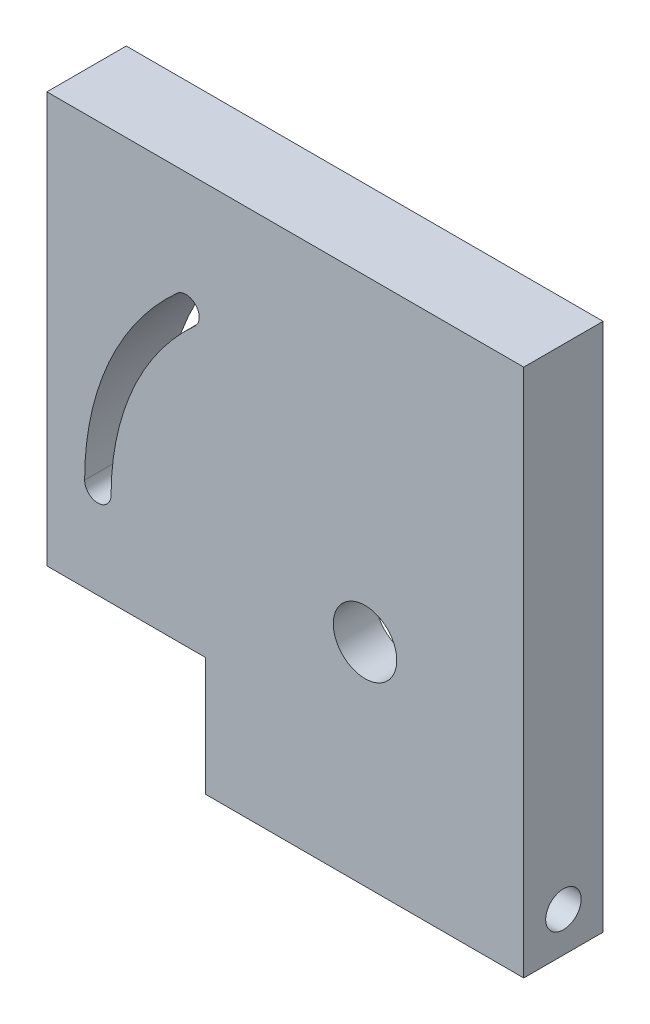
ISO-10303-21;
HEADER;
FILE_DESCRIPTION(('STEP AP214'),'2;1');
FILE_NAME('part.step','',(''),(''),'','','');
FILE_SCHEMA(('AUTOMOTIVE_DESIGN { 1 0 10303 214 1 1 1 1 }'));
ENDSEC;
DATA;
#1=APPLICATION_CONTEXT('core data for automotive mechanical design processes');
#2=APPLICATION_PROTOCOL_DEFINITION('international standard','automotive_design',2000,#1);
#3=PRODUCT_CONTEXT('',#1,'mechanical');
#4=PRODUCT('Part','Part','',(#3));
#5=PRODUCT_RELATED_PRODUCT_CATEGORY('part','',(#4));
#6=PRODUCT_DEFINITION_FORMATION('','',#4);
#7=PRODUCT_DEFINITION_CONTEXT('part definition',#1,'design');
#8=PRODUCT_DEFINITION('design','',#6,#7);
#9=PRODUCT_DEFINITION_SHAPE('','',#8);
#10=(LENGTH_UNIT() NAMED_UNIT(*) SI_UNIT(.MILLI.,.METRE.));
#11=(NAMED_UNIT(*) PLANE_ANGLE_UNIT() SI_UNIT($,.RADIAN.));
#12=(NAMED_UNIT(*) SI_UNIT($,.STERADIAN.) SOLID_ANGLE_UNIT());
#13=UNCERTAINTY_MEASURE_WITH_UNIT(LENGTH_MEASURE(1.E-05),#10,'distance_accuracy_value','');
#14=(GEOMETRIC_REPRESENTATION_CONTEXT(3) GLOBAL_UNCERTAINTY_ASSIGNED_CONTEXT((#13)) GLOBAL_UNIT_ASSIGNED_CONTEXT((#10,
#11,#12)) REPRESENTATION_CONTEXT('',''));
#15=CARTESIAN_POINT('',(0.,0.,0.));
#16=DIRECTION('',(0.,0.,1.));
#17=DIRECTION('',(1.,0.,0.));
#18=AXIS2_PLACEMENT_3D('',#15,#16,#17);
#19=CARTESIAN_POINT('',(-60.1333786137793,60.,0.));
#20=DIRECTION('',(-1.,0.,0.));
#21=DIRECTION('',(0.,-1.,0.));
#22=AXIS2_PLACEMENT_3D('',#19,#20,#21);
#23=PLANE('',#22);
#24=DIRECTION('',(0.,0.,-1.));
#25=VECTOR('',#24,1.);
#26=CARTESIAN_POINT('',(-60.1333786137793,-17.6108597435363,0.));
#27=LINE('',#26,#25);
#28=CARTESIAN_POINT('',(-60.1333786137793,-17.6108597435363,15.));
#29=VERTEX_POINT('',#28);
#30=CARTESIAN_POINT('',(-60.1333786137793,-17.6108597435363,0.));
#31=VERTEX_POINT('',#30);
#32=EDGE_CURVE('E164',#29,#31,#27,.T.);
#33=ORIENTED_EDGE('',*,*,#32,.F.);
#34=DIRECTION('',(0.,-1.,0.));
#35=VECTOR('',#34,1.);
#36=CARTESIAN_POINT('',(-60.1333786137793,60.,15.));
#37=LINE('',#36,#35);
#38=CARTESIAN_POINT('',(-60.1333786137793,60.,15.));
#39=VERTEX_POINT('',#38);
#40=EDGE_CURVE('E194',#39,#29,#37,.T.);
#41=ORIENTED_EDGE('',*,*,#40,.F.);
#42=DIRECTION('',(0.,0.,1.));
#43=VECTOR('',#42,1.);
#44=CARTESIAN_POINT('',(-60.1333786137793,60.,0.));
#45=LINE('',#44,#43);
#46=CARTESIAN_POINT('',(-60.1333786137793,60.,0.));
#47=VERTEX_POINT('',#46);
#48=EDGE_CURVE('E11',#47,#39,#45,.T.);
#49=ORIENTED_EDGE('',*,*,#48,.F.);
#50=DIRECTION('',(0.,-1.,0.));
#51=VECTOR('',#50,1.);
#52=CARTESIAN_POINT('',(-60.1333786137793,60.,0.));
#53=LINE('',#52,#51);
#54=EDGE_CURVE('E195',#47,#31,#53,.T.);
#55=ORIENTED_EDGE('',*,*,#54,.T.);
#56=EDGE_LOOP('',(#33,#41,#49,#55));
#57=FACE_BOUND('',#56,.T.);
#58=ADVANCED_FACE('F41',(#57),#23,.T.);
#59=CARTESIAN_POINT('',(30.,60.,0.));
#60=DIRECTION('',(0.,1.,0.));
#61=DIRECTION('',(0.,0.,1.));
#62=AXIS2_PLACEMENT_3D('',#59,#60,#61);
#63=PLANE('',#62);
#64=DIRECTION('',(-1.,0.,0.));
#65=VECTOR('',#64,1.);
#66=CARTESIAN_POINT('',(30.,60.,15.));
#67=LINE('',#66,#65);
#68=CARTESIAN_POINT('',(30.,60.,15.));
#69=VERTEX_POINT('',#68);
#70=EDGE_CURVE('E199',#69,#39,#67,.T.);
#71=ORIENTED_EDGE('',*,*,#70,.F.);
#72=DIRECTION('',(0.,0.,1.));
#73=VECTOR('',#72,1.);
#74=CARTESIAN_POINT('',(30.,60.,0.));
#75=LINE('',#74,#73);
#76=CARTESIAN_POINT('',(30.,60.,0.));
#77=VERTEX_POINT('',#76);
#78=EDGE_CURVE('E49',#77,#69,#75,.T.);
#79=ORIENTED_EDGE('',*,*,#78,.F.);
#80=DIRECTION('',(-1.,0.,0.));
#81=VECTOR('',#80,1.);
#82=CARTESIAN_POINT('',(30.,60.,0.));
#83=LINE('',#82,#81);
#84=EDGE_CURVE('E204',#77,#47,#83,.T.);
#85=ORIENTED_EDGE('',*,*,#84,.T.);
#86=ORIENTED_EDGE('',*,*,#48,.T.);
#87=EDGE_LOOP('',(#71,#79,#85,#86));
#88=FACE_BOUND('',#87,.T.);
#89=ADVANCED_FACE('F233',(#88),#63,.T.);
#90=CARTESIAN_POINT('',(30.,-40.,0.));
#91=DIRECTION('',(1.,0.,0.));
#92=DIRECTION('',(0.,0.,-1.));
#93=AXIS2_PLACEMENT_3D('',#90,#91,#92);
#94=PLANE('',#93);
#95=CARTESIAN_POINT('',(30.,-32.5,7.5));
#96=DIRECTION('',(1.,0.,0.));
#97=DIRECTION('',(0.,0.,-1.));
#98=AXIS2_PLACEMENT_3D('',#95,#96,#97);
#99=CIRCLE('',#98,3.35);
#100=CARTESIAN_POINT('',(30.,-32.5,4.15));
#101=VERTEX_POINT('',#100);
#102=EDGE_CURVE('E151',#101,#101,#99,.T.);
#103=ORIENTED_EDGE('',*,*,#102,.F.);
#104=EDGE_LOOP('',(#103));
#105=FACE_BOUND('',#104,.T.);
#106=DIRECTION('',(0.,1.,0.));
#107=VECTOR('',#106,1.);
#108=CARTESIAN_POINT('',(30.,-40.,15.));
#109=LINE('',#108,#107);
#110=CARTESIAN_POINT('',(30.,-40.,15.));
#111=VERTEX_POINT('',#110);
#112=EDGE_CURVE('E211',#111,#69,#109,.T.);
#113=ORIENTED_EDGE('',*,*,#112,.F.);
#114=DIRECTION('',(0.,0.,1.));
#115=VECTOR('',#114,1.);
#116=CARTESIAN_POINT('',(30.,-40.,0.));
#117=LINE('',#116,#115);
#118=CARTESIAN_POINT('',(30.,-40.,0.));
#119=VERTEX_POINT('',#118);
#120=EDGE_CURVE('E44',#119,#111,#117,.T.);
#121=ORIENTED_EDGE('',*,*,#120,.F.);
#122=DIRECTION('',(0.,1.,0.));
#123=VECTOR('',#122,1.);
#124=CARTESIAN_POINT('',(30.,-40.,0.));
#125=LINE('',#124,#123);
#126=EDGE_CURVE('E201',#119,#77,#125,.T.);
#127=ORIENTED_EDGE('',*,*,#126,.T.);
#128=ORIENTED_EDGE('',*,*,#78,.T.);
#129=EDGE_LOOP('',(#113,#121,#127,#128));
#130=FACE_BOUND('',#129,.T.);
#131=ADVANCED_FACE('F225',(#105,#130),#94,.T.);
#132=CARTESIAN_POINT('',(-60.1333786137793,-40.,0.));
#133=DIRECTION('',(0.,-1.,0.));
#134=DIRECTION('',(0.,0.,-1.));
#135=AXIS2_PLACEMENT_3D('',#132,#133,#134);
#136=PLANE('',#135);
#137=DIRECTION('',(0.,0.,1.));
#138=VECTOR('',#137,1.);
#139=CARTESIAN_POINT('',(-30.1333786137793,-40.,0.));
#140=LINE('',#139,#138);
#141=CARTESIAN_POINT('',(-30.1333786137793,-40.,0.));
#142=VERTEX_POINT('',#141);
#143=CARTESIAN_POINT('',(-30.1333786137793,-40.,15.));
#144=VERTEX_POINT('',#143);
#145=EDGE_CURVE('E169',#142,#144,#140,.T.);
#146=ORIENTED_EDGE('',*,*,#145,.F.);
#147=DIRECTION('',(1.,0.,0.));
#148=VECTOR('',#147,1.);
#149=CARTESIAN_POINT('',(-60.1333786137793,-40.,0.));
#150=LINE('',#149,#148);
#151=EDGE_CURVE('E198',#142,#119,#150,.T.);
#152=ORIENTED_EDGE('',*,*,#151,.T.);
#153=ORIENTED_EDGE('',*,*,#120,.T.);
#154=DIRECTION('',(1.,0.,0.));
#155=VECTOR('',#154,1.);
#156=CARTESIAN_POINT('',(-60.1333786137793,-40.,15.));
#157=LINE('',#156,#155);
#158=EDGE_CURVE('E209',#144,#111,#157,.T.);
#159=ORIENTED_EDGE('',*,*,#158,.F.);
#160=EDGE_LOOP('',(#146,#152,#153,#159));
#161=FACE_BOUND('',#160,.T.);
#162=ADVANCED_FACE('F222',(#161),#136,.T.);
#163=CARTESIAN_POINT('',(0.,0.,0.));
#164=DIRECTION('',(0.,0.,1.));
#165=DIRECTION('',(1.,0.,0.));
#166=AXIS2_PLACEMENT_3D('',#163,#164,#165);
#167=PLANE('',#166);
#168=CARTESIAN_POINT('',(4.30211422042248E-13,-1.90819582357449E-13,0.));
#169=DIRECTION('',(0.,0.,-1.));
#170=DIRECTION('',(1.,0.,0.));
#171=AXIS2_PLACEMENT_3D('',#168,#169,#170);
#172=CIRCLE('',#171,48.0033208953854);
#173=CARTESIAN_POINT('',(-48.0033208953849,0.,0.));
#174=VERTEX_POINT('',#173);
#175=CARTESIAN_POINT('',(-32.1736462526308,35.6254867166173,0.));
#176=VERTEX_POINT('',#175);
#177=EDGE_CURVE('E126',#174,#176,#172,.T.);
#178=ORIENTED_EDGE('',*,*,#177,.T.);
#179=CARTESIAN_POINT('',(-33.8492410683909,37.480852452368,0.));
#180=DIRECTION('',(0.,0.,1.));
#181=DIRECTION('',(1.,0.,0.));
#182=AXIS2_PLACEMENT_3D('',#179,#180,#181);
#183=CIRCLE('',#182,2.50000000000001);
#184=CARTESIAN_POINT('',(-35.524835884151,39.3362181881187,0.));
#185=VERTEX_POINT('',#184);
#186=EDGE_CURVE('E120',#176,#185,#183,.T.);
#187=ORIENTED_EDGE('',*,*,#186,.T.);
#188=CARTESIAN_POINT('',(4.30211422042248E-13,-1.90819582357449E-13,0.));
#189=DIRECTION('',(0.,0.,1.));
#190=DIRECTION('',(1.,0.,0.));
#191=AXIS2_PLACEMENT_3D('',#188,#189,#190);
#192=CIRCLE('',#191,53.0033208953854);
#193=CARTESIAN_POINT('',(-53.0033208953849,0.,0.));
#194=VERTEX_POINT('',#193);
#195=EDGE_CURVE('E129',#185,#194,#192,.T.);
#196=ORIENTED_EDGE('',*,*,#195,.T.);
#197=CARTESIAN_POINT('',(-50.5033208953849,0.,0.));
#198=DIRECTION('',(0.,0.,1.));
#199=DIRECTION('',(1.,0.,0.));
#200=AXIS2_PLACEMENT_3D('',#197,#198,#199);
#201=CIRCLE('',#200,2.5);
#202=EDGE_CURVE('E57',#194,#174,#201,.T.);
#203=ORIENTED_EDGE('',*,*,#202,.T.);
#204=EDGE_LOOP('',(#178,#187,#196,#203));
#205=FACE_BOUND('',#204,.T.);
#206=CARTESIAN_POINT('',(0.,0.,0.));
#207=DIRECTION('',(0.,0.,-1.));
#208=DIRECTION('',(-1.,0.,0.));
#209=AXIS2_PLACEMENT_3D('',#206,#207,#208);
#210=CIRCLE('',#209,17.5);
#211=CARTESIAN_POINT('',(-17.5,0.,0.));
#212=VERTEX_POINT('',#211);
#213=EDGE_CURVE('E181',#212,#212,#210,.T.);
#214=ORIENTED_EDGE('',*,*,#213,.F.);
#215=EDGE_LOOP('',(#214));
#216=FACE_BOUND('',#215,.T.);
#217=DIRECTION('',(0.,-1.,0.));
#218=VECTOR('',#217,1.);
#219=CARTESIAN_POINT('',(-30.1333786137793,-40.,0.));
#220=LINE('',#219,#218);
#221=CARTESIAN_POINT('',(-30.1333786137793,-17.6108597435363,0.));
#222=VERTEX_POINT('',#221);
#223=EDGE_CURVE('E167',#222,#142,#220,.T.);
#224=ORIENTED_EDGE('',*,*,#223,.F.);
#225=DIRECTION('',(-1.,0.,0.));
#226=VECTOR('',#225,1.);
#227=CARTESIAN_POINT('',(-30.1333786137793,-17.6108597435363,0.));
#228=LINE('',#227,#226);
#229=EDGE_CURVE('E178',#222,#31,#228,.T.);
#230=ORIENTED_EDGE('',*,*,#229,.T.);
#231=ORIENTED_EDGE('',*,*,#54,.F.);
#232=ORIENTED_EDGE('',*,*,#84,.F.);
#233=ORIENTED_EDGE('',*,*,#126,.F.);
#234=ORIENTED_EDGE('',*,*,#151,.F.);
#235=EDGE_LOOP('',(#224,#230,#231,#232,#233,#234));
#236=FACE_BOUND('',#235,.T.);
#237=ADVANCED_FACE('F133',(#205,#216,#236),#167,.F.);
#238=CARTESIAN_POINT('',(0.,0.,15.));
#239=DIRECTION('',(0.,0.,1.));
#240=DIRECTION('',(1.,0.,0.));
#241=AXIS2_PLACEMENT_3D('',#238,#239,#240);
#242=PLANE('',#241);
#243=CARTESIAN_POINT('',(-33.8492410683909,37.480852452368,15.));
#244=DIRECTION('',(0.,0.,1.));
#245=DIRECTION('',(1.,0.,0.));
#246=AXIS2_PLACEMENT_3D('',#243,#244,#245);
#247=CIRCLE('',#246,2.50000000000001);
#248=CARTESIAN_POINT('',(-32.1736462526308,35.6254867166173,15.));
#249=VERTEX_POINT('',#248);
#250=CARTESIAN_POINT('',(-35.524835884151,39.3362181881187,15.));
#251=VERTEX_POINT('',#250);
#252=EDGE_CURVE('E65',#249,#251,#247,.T.);
#253=ORIENTED_EDGE('',*,*,#252,.F.);
#254=CARTESIAN_POINT('',(4.30211422042248E-13,-1.90819582357449E-13,15.));
#255=DIRECTION('',(0.,0.,-1.));
#256=DIRECTION('',(1.,0.,0.));
#257=AXIS2_PLACEMENT_3D('',#254,#255,#256);
#258=CIRCLE('',#257,48.0033208953854);
#259=CARTESIAN_POINT('',(-48.0033208953849,0.,15.));
#260=VERTEX_POINT('',#259);
#261=EDGE_CURVE('E136',#260,#249,#258,.T.);
#262=ORIENTED_EDGE('',*,*,#261,.F.);
#263=CARTESIAN_POINT('',(-50.5033208953849,0.,15.));
#264=DIRECTION('',(0.,0.,1.));
#265=DIRECTION('',(1.,0.,0.));
#266=AXIS2_PLACEMENT_3D('',#263,#264,#265);
#267=CIRCLE('',#266,2.5);
#268=CARTESIAN_POINT('',(-53.0033208953849,0.,15.));
#269=VERTEX_POINT('',#268);
#270=EDGE_CURVE('E139',#269,#260,#267,.T.);
#271=ORIENTED_EDGE('',*,*,#270,.F.);
#272=CARTESIAN_POINT('',(4.30211422042248E-13,-1.90819582357449E-13,15.));
#273=DIRECTION('',(0.,0.,1.));
#274=DIRECTION('',(1.,0.,0.));
#275=AXIS2_PLACEMENT_3D('',#272,#273,#274);
#276=CIRCLE('',#275,53.0033208953854);
#277=EDGE_CURVE('E145',#251,#269,#276,.T.);
#278=ORIENTED_EDGE('',*,*,#277,.F.);
#279=EDGE_LOOP('',(#253,#262,#271,#278));
#280=FACE_BOUND('',#279,.T.);
#281=DIRECTION('',(-1.,0.,0.));
#282=VECTOR('',#281,1.);
#283=CARTESIAN_POINT('',(-30.1333786137793,-17.6108597435363,15.));
#284=LINE('',#283,#282);
#285=CARTESIAN_POINT('',(-30.1333786137793,-17.6108597435363,15.));
#286=VERTEX_POINT('',#285);
#287=EDGE_CURVE('E176',#286,#29,#284,.T.);
#288=ORIENTED_EDGE('',*,*,#287,.F.);
#289=DIRECTION('',(0.,1.,0.));
#290=VECTOR('',#289,1.);
#291=CARTESIAN_POINT('',(-30.1333786137793,-40.,15.));
#292=LINE('',#291,#290);
#293=EDGE_CURVE('E171',#144,#286,#292,.T.);
#294=ORIENTED_EDGE('',*,*,#293,.F.);
#295=ORIENTED_EDGE('',*,*,#158,.T.);
#296=ORIENTED_EDGE('',*,*,#112,.T.);
#297=ORIENTED_EDGE('',*,*,#70,.T.);
#298=ORIENTED_EDGE('',*,*,#40,.T.);
#299=EDGE_LOOP('',(#288,#294,#295,#296,#297,#298));
#300=FACE_BOUND('',#299,.T.);
#301=CARTESIAN_POINT('',(0.,0.,15.));
#302=DIRECTION('',(0.,0.,-1.));
#303=DIRECTION('',(-1.,0.,0.));
#304=AXIS2_PLACEMENT_3D('',#301,#302,#303);
#305=CIRCLE('',#304,6.00000000000001);
#306=CARTESIAN_POINT('',(-6.00000000000001,0.,15.));
#307=VERTEX_POINT('',#306);
#308=EDGE_CURVE('E191',#307,#307,#305,.T.);
#309=ORIENTED_EDGE('',*,*,#308,.T.);
#310=EDGE_LOOP('',(#309));
#311=FACE_BOUND('',#310,.T.);
#312=ADVANCED_FACE('F229',(#280,#300,#311),#242,.T.);
#313=CARTESIAN_POINT('',(0.,0.,0.));
#314=DIRECTION('',(0.,0.,-1.));
#315=DIRECTION('',(-1.,0.,0.));
#316=AXIS2_PLACEMENT_3D('',#313,#314,#315);
#317=CYLINDRICAL_SURFACE('',#316,6.00000000000001);
#318=ORIENTED_EDGE('',*,*,#308,.F.);
#319=EDGE_LOOP('',(#318));
#320=FACE_BOUND('',#319,.T.);
#321=CARTESIAN_POINT('',(0.,0.,7.));
#322=DIRECTION('',(0.,0.,-1.));
#323=DIRECTION('',(-1.,0.,0.));
#324=AXIS2_PLACEMENT_3D('',#321,#322,#323);
#325=CIRCLE('',#324,6.00000000000001);
#326=CARTESIAN_POINT('',(-6.00000000000001,0.,7.));
#327=VERTEX_POINT('',#326);
#328=EDGE_CURVE('E188',#327,#327,#325,.T.);
#329=ORIENTED_EDGE('',*,*,#328,.T.);
#330=EDGE_LOOP('',(#329));
#331=FACE_BOUND('',#330,.T.);
#332=ADVANCED_FACE('F252',(#320,#331),#317,.F.);
#333=CARTESIAN_POINT('',(6.00000000000001,0.,7.));
#334=DIRECTION('',(0.,0.,1.));
#335=DIRECTION('',(1.,0.,0.));
#336=AXIS2_PLACEMENT_3D('',#333,#334,#335);
#337=PLANE('',#336);
#338=ORIENTED_EDGE('',*,*,#328,.F.);
#339=EDGE_LOOP('',(#338));
#340=FACE_BOUND('',#339,.T.);
#341=CARTESIAN_POINT('',(0.,0.,7.));
#342=DIRECTION('',(0.,0.,-1.));
#343=DIRECTION('',(-1.,0.,0.));
#344=AXIS2_PLACEMENT_3D('',#341,#342,#343);
#345=CIRCLE('',#344,17.5);
#346=CARTESIAN_POINT('',(-17.5,0.,7.));
#347=VERTEX_POINT('',#346);
#348=EDGE_CURVE('E185',#347,#347,#345,.T.);
#349=ORIENTED_EDGE('',*,*,#348,.T.);
#350=EDGE_LOOP('',(#349));
#351=FACE_BOUND('',#350,.T.);
#352=ADVANCED_FACE('F300',(#340,#351),#337,.F.);
#353=CARTESIAN_POINT('',(0.,0.,0.));
#354=DIRECTION('',(0.,0.,-1.));
#355=DIRECTION('',(-1.,0.,0.));
#356=AXIS2_PLACEMENT_3D('',#353,#354,#355);
#357=CYLINDRICAL_SURFACE('',#356,17.5);
#358=ORIENTED_EDGE('',*,*,#348,.F.);
#359=EDGE_LOOP('',(#358));
#360=FACE_BOUND('',#359,.T.);
#361=ORIENTED_EDGE('',*,*,#213,.T.);
#362=EDGE_LOOP('',(#361));
#363=FACE_BOUND('',#362,.T.);
#364=ADVANCED_FACE('F298',(#360,#363),#357,.F.);
#365=CARTESIAN_POINT('',(-30.1333786137793,-17.6108597435363,0.));
#366=DIRECTION('',(0.,1.,0.));
#367=DIRECTION('',(-1.,0.,0.));
#368=AXIS2_PLACEMENT_3D('',#365,#366,#367);
#369=PLANE('',#368);
#370=ORIENTED_EDGE('',*,*,#32,.T.);
#371=ORIENTED_EDGE('',*,*,#229,.F.);
#372=DIRECTION('',(0.,0.,-1.));
#373=VECTOR('',#372,1.);
#374=CARTESIAN_POINT('',(-30.1333786137793,-17.6108597435363,0.));
#375=LINE('',#374,#373);
#376=EDGE_CURVE('E173',#286,#222,#375,.T.);
#377=ORIENTED_EDGE('',*,*,#376,.F.);
#378=ORIENTED_EDGE('',*,*,#287,.T.);
#379=EDGE_LOOP('',(#370,#371,#377,#378));
#380=FACE_BOUND('',#379,.T.);
#381=ADVANCED_FACE('F241',(#380),#369,.F.);
#382=CARTESIAN_POINT('',(-30.1333786137793,0.,0.));
#383=DIRECTION('',(1.,0.,0.));
#384=DIRECTION('',(0.,1.,0.));
#385=AXIS2_PLACEMENT_3D('',#382,#383,#384);
#386=PLANE('',#385);
#387=CARTESIAN_POINT('',(-30.1333786137793,-32.5,7.5));
#388=DIRECTION('',(-1.,0.,0.));
#389=DIRECTION('',(0.,-1.,0.));
#390=AXIS2_PLACEMENT_3D('',#387,#388,#389);
#391=CIRCLE('',#390,3.35);
#392=CARTESIAN_POINT('',(-30.1333786137793,-35.85,7.5));
#393=VERTEX_POINT('',#392);
#394=EDGE_CURVE('E158',#393,#393,#391,.T.);
#395=ORIENTED_EDGE('',*,*,#394,.F.);
#396=EDGE_LOOP('',(#395));
#397=FACE_BOUND('',#396,.T.);
#398=ORIENTED_EDGE('',*,*,#223,.T.);
#399=ORIENTED_EDGE('',*,*,#145,.T.);
#400=ORIENTED_EDGE('',*,*,#293,.T.);
#401=ORIENTED_EDGE('',*,*,#376,.T.);
#402=EDGE_LOOP('',(#398,#399,#400,#401));
#403=FACE_BOUND('',#402,.T.);
#404=ADVANCED_FACE('F244',(#397,#403),#386,.F.);
#405=CARTESIAN_POINT('',(-20.1333786137793,-32.5,7.5));
#406=DIRECTION('',(-1.,0.,0.));
#407=DIRECTION('',(0.,-1.,0.));
#408=AXIS2_PLACEMENT_3D('',#405,#406,#407);
#409=CYLINDRICAL_SURFACE('',#408,3.35);
#410=CARTESIAN_POINT('',(-20.1333786137793,-32.5,7.5));
#411=DIRECTION('',(-1.,0.,0.));
#412=DIRECTION('',(0.,-1.,0.));
#413=AXIS2_PLACEMENT_3D('',#410,#411,#412);
#414=CIRCLE('',#413,3.35);
#415=CARTESIAN_POINT('',(-20.1333786137793,-35.85,7.5));
#416=VERTEX_POINT('',#415);
#417=EDGE_CURVE('E161',#416,#416,#414,.T.);
#418=ORIENTED_EDGE('',*,*,#417,.F.);
#419=EDGE_LOOP('',(#418));
#420=FACE_BOUND('',#419,.T.);
#421=ORIENTED_EDGE('',*,*,#394,.T.);
#422=EDGE_LOOP('',(#421));
#423=FACE_BOUND('',#422,.T.);
#424=ADVANCED_FACE('F284',(#420,#423),#409,.F.);
#425=CARTESIAN_POINT('',(-20.1333786137793,-32.5,7.5));
#426=DIRECTION('',(-1.,0.,0.));
#427=DIRECTION('',(0.,-1.,0.));
#428=AXIS2_PLACEMENT_3D('',#425,#426,#427);
#429=PLANE('',#428);
#430=ORIENTED_EDGE('',*,*,#417,.T.);
#431=EDGE_LOOP('',(#430));
#432=FACE_BOUND('',#431,.T.);
#433=ADVANCED_FACE('F277',(#432),#429,.T.);
#434=CARTESIAN_POINT('',(20.,-32.5,7.5));
#435=DIRECTION('',(1.,0.,0.));
#436=DIRECTION('',(0.,0.,-1.));
#437=AXIS2_PLACEMENT_3D('',#434,#435,#436);
#438=CYLINDRICAL_SURFACE('',#437,3.35);
#439=CARTESIAN_POINT('',(20.,-32.5,7.5));
#440=DIRECTION('',(1.,0.,0.));
#441=DIRECTION('',(0.,0.,-1.));
#442=AXIS2_PLACEMENT_3D('',#439,#440,#441);
#443=CIRCLE('',#442,3.35);
#444=CARTESIAN_POINT('',(20.,-32.5,4.15));
#445=VERTEX_POINT('',#444);
#446=EDGE_CURVE('E155',#445,#445,#443,.T.);
#447=ORIENTED_EDGE('',*,*,#446,.F.);
#448=EDGE_LOOP('',(#447));
#449=FACE_BOUND('',#448,.T.);
#450=ORIENTED_EDGE('',*,*,#102,.T.);
#451=EDGE_LOOP('',(#450));
#452=FACE_BOUND('',#451,.T.);
#453=ADVANCED_FACE('F275',(#449,#452),#438,.F.);
#454=CARTESIAN_POINT('',(20.,-32.5,7.5));
#455=DIRECTION('',(1.,0.,0.));
#456=DIRECTION('',(0.,0.,-1.));
#457=AXIS2_PLACEMENT_3D('',#454,#455,#456);
#458=PLANE('',#457);
#459=ORIENTED_EDGE('',*,*,#446,.T.);
#460=EDGE_LOOP('',(#459));
#461=FACE_BOUND('',#460,.T.);
#462=ADVANCED_FACE('F276',(#461),#458,.T.);
#463=CARTESIAN_POINT('',(-33.8492410683909,37.480852452368,0.));
#464=DIRECTION('',(0.,0.,1.));
#465=DIRECTION('',(1.,0.,0.));
#466=AXIS2_PLACEMENT_3D('',#463,#464,#465);
#467=CYLINDRICAL_SURFACE('',#466,2.50000000000001);
#468=ORIENTED_EDGE('',*,*,#252,.T.);
#469=DIRECTION('',(0.,0.,1.));
#470=VECTOR('',#469,1.);
#471=CARTESIAN_POINT('',(-35.524835884151,39.3362181881187,0.));
#472=LINE('',#471,#470);
#473=EDGE_CURVE('E116',#185,#251,#472,.T.);
#474=ORIENTED_EDGE('',*,*,#473,.F.);
#475=ORIENTED_EDGE('',*,*,#186,.F.);
#476=DIRECTION('',(0.,0.,1.));
#477=VECTOR('',#476,1.);
#478=CARTESIAN_POINT('',(-32.1736462526308,35.6254867166173,0.));
#479=LINE('',#478,#477);
#480=EDGE_CURVE('E149',#176,#249,#479,.T.);
#481=ORIENTED_EDGE('',*,*,#480,.T.);
#482=EDGE_LOOP('',(#468,#474,#475,#481));
#483=FACE_BOUND('',#482,.T.);
#484=ADVANCED_FACE('F118',(#483),#467,.F.);
#485=CARTESIAN_POINT('',(4.30211422042248E-13,-1.90819582357449E-13,0.));
#486=DIRECTION('',(0.,0.,1.));
#487=DIRECTION('',(1.,0.,0.));
#488=AXIS2_PLACEMENT_3D('',#485,#486,#487);
#489=CYLINDRICAL_SURFACE('',#488,48.0033208953854);
#490=ORIENTED_EDGE('',*,*,#261,.T.);
#491=ORIENTED_EDGE('',*,*,#480,.F.);
#492=ORIENTED_EDGE('',*,*,#177,.F.);
#493=DIRECTION('',(0.,0.,1.));
#494=VECTOR('',#493,1.);
#495=CARTESIAN_POINT('',(-48.0033208953849,0.,0.));
#496=LINE('',#495,#494);
#497=EDGE_CURVE('E152',#174,#260,#496,.T.);
#498=ORIENTED_EDGE('',*,*,#497,.T.);
#499=EDGE_LOOP('',(#490,#491,#492,#498));
#500=FACE_BOUND('',#499,.T.);
#501=ADVANCED_FACE('F369',(#500),#489,.T.);
#502=CARTESIAN_POINT('',(-50.5033208953849,0.,0.));
#503=DIRECTION('',(0.,0.,1.));
#504=DIRECTION('',(1.,0.,0.));
#505=AXIS2_PLACEMENT_3D('',#502,#503,#504);
#506=CYLINDRICAL_SURFACE('',#505,2.5);
#507=ORIENTED_EDGE('',*,*,#270,.T.);
#508=ORIENTED_EDGE('',*,*,#497,.F.);
#509=ORIENTED_EDGE('',*,*,#202,.F.);
#510=DIRECTION('',(0.,0.,1.));
#511=VECTOR('',#510,1.);
#512=CARTESIAN_POINT('',(-53.0033208953849,0.,0.));
#513=LINE('',#512,#511);
#514=EDGE_CURVE('E125',#194,#269,#513,.T.);
#515=ORIENTED_EDGE('',*,*,#514,.T.);
#516=EDGE_LOOP('',(#507,#508,#509,#515));
#517=FACE_BOUND('',#516,.T.);
#518=ADVANCED_FACE('F377',(#517),#506,.F.);
#519=CARTESIAN_POINT('',(4.30211422042248E-13,-1.90819582357449E-13,0.));
#520=DIRECTION('',(0.,0.,1.));
#521=DIRECTION('',(1.,0.,0.));
#522=AXIS2_PLACEMENT_3D('',#519,#520,#521);
#523=CYLINDRICAL_SURFACE('',#522,53.0033208953854);
#524=ORIENTED_EDGE('',*,*,#277,.T.);
#525=ORIENTED_EDGE('',*,*,#514,.F.);
#526=ORIENTED_EDGE('',*,*,#195,.F.);
#527=ORIENTED_EDGE('',*,*,#473,.T.);
#528=EDGE_LOOP('',(#524,#525,#526,#527));
#529=FACE_BOUND('',#528,.T.);
#530=ADVANCED_FACE('F130',(#529),#523,.F.);
#531=CLOSED_SHELL('',(#58,#89,#131,#162,#237,#312,#332,#352,#364,#381,#404,#424,#433,#453,#462,
#484,#501,#518,#530));
#532=MANIFOLD_SOLID_BREP('B2',#531);
#533=ADVANCED_BREP_SHAPE_REPRESENTATION('',(#18,#532),#14);
#534=SHAPE_DEFINITION_REPRESENTATION(#9,#533);
ENDSEC;
END-ISO-10303-21;
